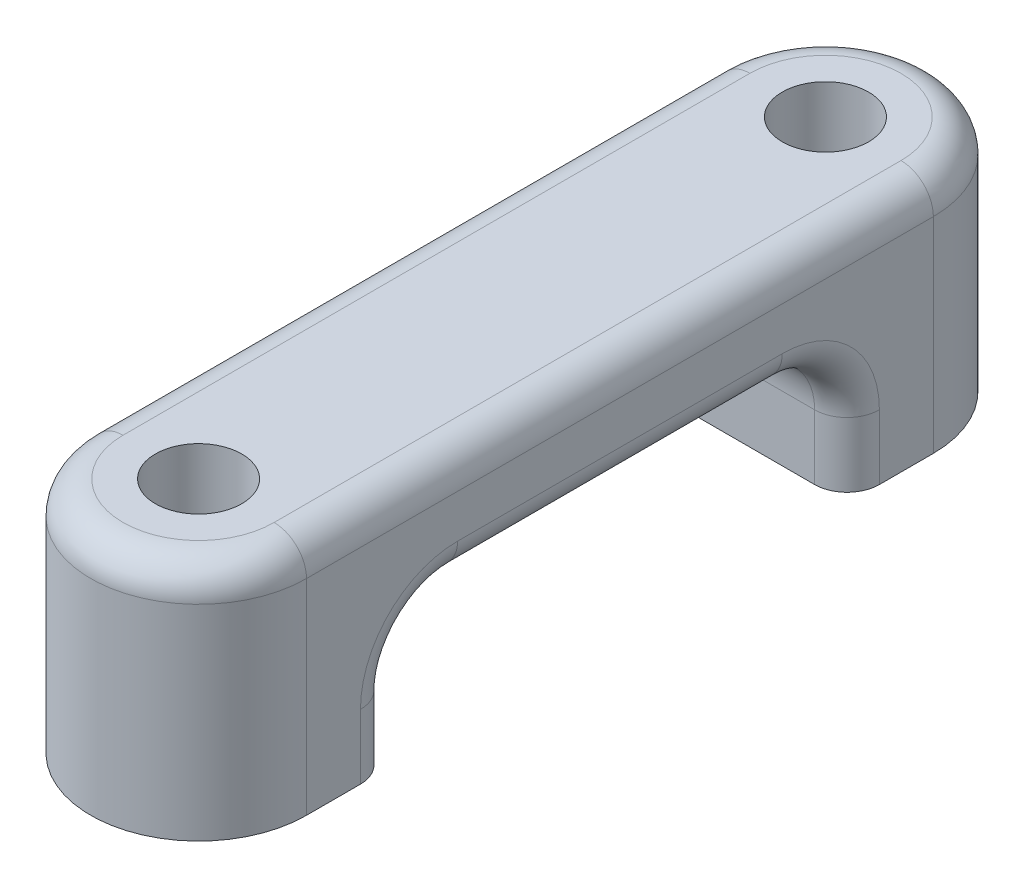
ISO-10303-21;
HEADER;
FILE_DESCRIPTION(('STEP AP214'),'2;1');
FILE_NAME('part.step','',(''),(''),'','','');
FILE_SCHEMA(('AUTOMOTIVE_DESIGN { 1 0 10303 214 1 1 1 1 }'));
ENDSEC;
DATA;
#1=APPLICATION_CONTEXT('core data for automotive mechanical design processes');
#2=APPLICATION_PROTOCOL_DEFINITION('international standard','automotive_design',2000,#1);
#3=PRODUCT_CONTEXT('',#1,'mechanical');
#4=PRODUCT('Part','Part','',(#3));
#5=PRODUCT_RELATED_PRODUCT_CATEGORY('part','',(#4));
#6=PRODUCT_DEFINITION_FORMATION('','',#4);
#7=PRODUCT_DEFINITION_CONTEXT('part definition',#1,'design');
#8=PRODUCT_DEFINITION('design','',#6,#7);
#9=PRODUCT_DEFINITION_SHAPE('','',#8);
#10=(LENGTH_UNIT() NAMED_UNIT(*) SI_UNIT(.MILLI.,.METRE.));
#11=(NAMED_UNIT(*) PLANE_ANGLE_UNIT() SI_UNIT($,.RADIAN.));
#12=(NAMED_UNIT(*) SI_UNIT($,.STERADIAN.) SOLID_ANGLE_UNIT());
#13=UNCERTAINTY_MEASURE_WITH_UNIT(LENGTH_MEASURE(1.E-05),#10,'distance_accuracy_value','');
#14=(GEOMETRIC_REPRESENTATION_CONTEXT(3) GLOBAL_UNCERTAINTY_ASSIGNED_CONTEXT((#13)) GLOBAL_UNIT_ASSIGNED_CONTEXT((#10,
#11,#12)) REPRESENTATION_CONTEXT('',''));
#15=CARTESIAN_POINT('',(0.,0.,0.));
#16=DIRECTION('',(0.,0.,1.));
#17=DIRECTION('',(1.,0.,0.));
#18=AXIS2_PLACEMENT_3D('',#15,#16,#17);
#19=CARTESIAN_POINT('',(0.,0.,-14.5206785));
#20=DIRECTION('',(0.,-1.,0.));
#21=DIRECTION('',(0.,0.,-1.));
#22=AXIS2_PLACEMENT_3D('',#19,#20,#21);
#23=PLANE('',#22);
#24=DIRECTION('',(-1.,0.,0.));
#25=VECTOR('',#24,1.);
#26=CARTESIAN_POINT('',(0.,0.,-7.5206785));
#27=LINE('',#26,#25);
#28=CARTESIAN_POINT('',(-3.5,0.,-7.5206785));
#29=VERTEX_POINT('',#28);
#30=CARTESIAN_POINT('',(3.5,0.,-7.5206785));
#31=VERTEX_POINT('',#30);
#32=EDGE_CURVE('E259',#29,#31,#27,.F.);
#33=ORIENTED_EDGE('',*,*,#32,.T.);
#34=DIRECTION('',(0.,0.,-1.));
#35=VECTOR('',#34,1.);
#36=CARTESIAN_POINT('',(3.5,0.,7.5206785));
#37=LINE('',#36,#35);
#38=CARTESIAN_POINT('',(3.5,0.,7.5206785));
#39=VERTEX_POINT('',#38);
#40=EDGE_CURVE('E11',#31,#39,#37,.F.);
#41=ORIENTED_EDGE('',*,*,#40,.T.);
#42=DIRECTION('',(1.,0.,0.));
#43=VECTOR('',#42,1.);
#44=CARTESIAN_POINT('',(0.,0.,7.5206785));
#45=LINE('',#44,#43);
#46=CARTESIAN_POINT('',(-3.5,0.,7.5206785));
#47=VERTEX_POINT('',#46);
#48=EDGE_CURVE('E255',#39,#47,#45,.F.);
#49=ORIENTED_EDGE('',*,*,#48,.T.);
#50=DIRECTION('',(0.,0.,1.));
#51=VECTOR('',#50,1.);
#52=CARTESIAN_POINT('',(-3.5,0.,-7.5206785));
#53=LINE('',#52,#51);
#54=EDGE_CURVE('E55',#47,#29,#53,.F.);
#55=ORIENTED_EDGE('',*,*,#54,.T.);
#56=EDGE_LOOP('',(#33,#41,#49,#55));
#57=FACE_BOUND('',#56,.T.);
#58=ADVANCED_FACE('F45',(#57),#23,.T.);
#59=CARTESIAN_POINT('',(0.,5.,-14.5206785));
#60=DIRECTION('',(0.,-1.,0.));
#61=DIRECTION('',(0.,0.,-1.));
#62=AXIS2_PLACEMENT_3D('',#59,#60,#61);
#63=PLANE('',#62);
#64=CARTESIAN_POINT('',(0.,5.,-14.5206785));
#65=DIRECTION('',(0.,-1.,0.));
#66=DIRECTION('',(0.,0.,-1.));
#67=AXIS2_PLACEMENT_3D('',#64,#65,#66);
#68=CIRCLE('',#67,3.5);
#69=CARTESIAN_POINT('',(3.5,5.,-14.5206785));
#70=VERTEX_POINT('',#69);
#71=CARTESIAN_POINT('',(-3.5,5.,-14.5206785));
#72=VERTEX_POINT('',#71);
#73=EDGE_CURVE('E68',#70,#72,#68,.F.);
#74=ORIENTED_EDGE('',*,*,#73,.T.);
#75=DIRECTION('',(0.,0.,1.));
#76=VECTOR('',#75,1.);
#77=CARTESIAN_POINT('',(-3.5,5.,-14.5206785));
#78=LINE('',#77,#76);
#79=CARTESIAN_POINT('',(-3.5,5.,14.5206785));
#80=VERTEX_POINT('',#79);
#81=EDGE_CURVE('E63',#72,#80,#78,.T.);
#82=ORIENTED_EDGE('',*,*,#81,.T.);
#83=CARTESIAN_POINT('',(0.,5.,14.5206785));
#84=DIRECTION('',(0.,-1.,0.));
#85=DIRECTION('',(0.,0.,-1.));
#86=AXIS2_PLACEMENT_3D('',#83,#84,#85);
#87=CIRCLE('',#86,3.5);
#88=CARTESIAN_POINT('',(3.5,5.,14.5206785));
#89=VERTEX_POINT('',#88);
#90=EDGE_CURVE('E343',#80,#89,#87,.F.);
#91=ORIENTED_EDGE('',*,*,#90,.T.);
#92=DIRECTION('',(0.,0.,-1.));
#93=VECTOR('',#92,1.);
#94=CARTESIAN_POINT('',(3.5,5.,-14.5206785));
#95=LINE('',#94,#93);
#96=EDGE_CURVE('E338',#89,#70,#95,.T.);
#97=ORIENTED_EDGE('',*,*,#96,.T.);
#98=EDGE_LOOP('',(#74,#82,#91,#97));
#99=FACE_BOUND('',#98,.T.);
#100=CARTESIAN_POINT('',(0.,5.,-14.5206785));
#101=DIRECTION('',(0.,1.,0.));
#102=DIRECTION('',(0.,0.,1.));
#103=AXIS2_PLACEMENT_3D('',#100,#101,#102);
#104=CIRCLE('',#103,2.);
#105=CARTESIAN_POINT('',(0.,5.,-12.5206785));
#106=VERTEX_POINT('',#105);
#107=EDGE_CURVE('E240',#106,#106,#104,.T.);
#108=ORIENTED_EDGE('',*,*,#107,.F.);
#109=EDGE_LOOP('',(#108));
#110=FACE_BOUND('',#109,.T.);
#111=CARTESIAN_POINT('',(0.,5.,14.5206785));
#112=DIRECTION('',(0.,1.,0.));
#113=DIRECTION('',(0.,0.,-1.));
#114=AXIS2_PLACEMENT_3D('',#111,#112,#113);
#115=CIRCLE('',#114,2.);
#116=CARTESIAN_POINT('',(0.,5.,12.5206785));
#117=VERTEX_POINT('',#116);
#118=EDGE_CURVE('E236',#117,#117,#115,.T.);
#119=ORIENTED_EDGE('',*,*,#118,.F.);
#120=EDGE_LOOP('',(#119));
#121=FACE_BOUND('',#120,.T.);
#122=ADVANCED_FACE('F480',(#99,#110,#121),#63,.F.);
#123=CARTESIAN_POINT('',(0.,5.,-14.5206785));
#124=DIRECTION('',(0.,-1.,0.));
#125=DIRECTION('',(0.,0.,-1.));
#126=AXIS2_PLACEMENT_3D('',#123,#124,#125);
#127=CYLINDRICAL_SURFACE('',#126,5.);
#128=DIRECTION('',(0.,-1.,0.));
#129=VECTOR('',#128,1.);
#130=CARTESIAN_POINT('',(-5.,5.,-14.5206785));
#131=LINE('',#130,#129);
#132=CARTESIAN_POINT('',(-5.,3.5,-14.5206785));
#133=VERTEX_POINT('',#132);
#134=CARTESIAN_POINT('',(-5.,-6.,-14.5206785));
#135=VERTEX_POINT('',#134);
#136=EDGE_CURVE('E248',#133,#135,#131,.T.);
#137=ORIENTED_EDGE('',*,*,#136,.F.);
#138=CARTESIAN_POINT('',(0.,3.5,-14.5206785));
#139=DIRECTION('',(0.,-1.,0.));
#140=DIRECTION('',(0.,0.,-1.));
#141=AXIS2_PLACEMENT_3D('',#138,#139,#140);
#142=CIRCLE('',#141,5.);
#143=CARTESIAN_POINT('',(5.,3.5,-14.5206785));
#144=VERTEX_POINT('',#143);
#145=EDGE_CURVE('E351',#133,#144,#142,.T.);
#146=ORIENTED_EDGE('',*,*,#145,.T.);
#147=DIRECTION('',(0.,-1.,0.));
#148=VECTOR('',#147,1.);
#149=CARTESIAN_POINT('',(5.,5.,-14.5206785));
#150=LINE('',#149,#148);
#151=CARTESIAN_POINT('',(5.,-6.,-14.5206785));
#152=VERTEX_POINT('',#151);
#153=EDGE_CURVE('E200',#144,#152,#150,.T.);
#154=ORIENTED_EDGE('',*,*,#153,.T.);
#155=CARTESIAN_POINT('',(0.,-6.,-14.5206785));
#156=DIRECTION('',(0.,-1.,0.));
#157=DIRECTION('',(0.,0.,-1.));
#158=AXIS2_PLACEMENT_3D('',#155,#156,#157);
#159=CIRCLE('',#158,5.);
#160=EDGE_CURVE('E224',#135,#152,#159,.T.);
#161=ORIENTED_EDGE('',*,*,#160,.F.);
#162=EDGE_LOOP('',(#137,#146,#154,#161));
#163=FACE_BOUND('',#162,.T.);
#164=ADVANCED_FACE('F405',(#163),#127,.T.);
#165=CARTESIAN_POINT('',(-5.,5.,14.5206785));
#166=DIRECTION('',(1.,0.,0.));
#167=DIRECTION('',(0.,0.,-1.));
#168=AXIS2_PLACEMENT_3D('',#165,#166,#167);
#169=PLANE('',#168);
#170=DIRECTION('',(0.,0.,-1.));
#171=VECTOR('',#170,1.);
#172=CARTESIAN_POINT('',(-5.,-6.,-10.5206785));
#173=LINE('',#172,#171);
#174=CARTESIAN_POINT('',(-5.,-6.,-12.0206785));
#175=VERTEX_POINT('',#174);
#176=EDGE_CURVE('E220',#175,#135,#173,.T.);
#177=ORIENTED_EDGE('',*,*,#176,.F.);
#178=DIRECTION('',(0.,1.,0.));
#179=VECTOR('',#178,1.);
#180=CARTESIAN_POINT('',(-5.,5.,-12.0206785));
#181=LINE('',#180,#179);
#182=CARTESIAN_POINT('',(-5.,-3.,-12.0206785));
#183=VERTEX_POINT('',#182);
#184=EDGE_CURVE('E334',#175,#183,#181,.T.);
#185=ORIENTED_EDGE('',*,*,#184,.T.);
#186=CARTESIAN_POINT('',(-5.,-3.,-7.5206785));
#187=DIRECTION('',(1.,0.,0.));
#188=DIRECTION('',(0.,0.,-1.));
#189=AXIS2_PLACEMENT_3D('',#186,#187,#188);
#190=CIRCLE('',#189,4.5);
#191=CARTESIAN_POINT('',(-5.,1.5,-7.5206785));
#192=VERTEX_POINT('',#191);
#193=EDGE_CURVE('E331',#183,#192,#190,.T.);
#194=ORIENTED_EDGE('',*,*,#193,.T.);
#195=DIRECTION('',(0.,0.,1.));
#196=VECTOR('',#195,1.);
#197=CARTESIAN_POINT('',(-5.,1.5,7.5206785));
#198=LINE('',#197,#196);
#199=CARTESIAN_POINT('',(-5.,1.5,7.5206785));
#200=VERTEX_POINT('',#199);
#201=EDGE_CURVE('E322',#192,#200,#198,.T.);
#202=ORIENTED_EDGE('',*,*,#201,.T.);
#203=CARTESIAN_POINT('',(-5.,-3.,7.5206785));
#204=DIRECTION('',(1.,0.,0.));
#205=DIRECTION('',(0.,0.,-1.));
#206=AXIS2_PLACEMENT_3D('',#203,#204,#205);
#207=CIRCLE('',#206,4.5);
#208=CARTESIAN_POINT('',(-5.,-3.,12.0206785));
#209=VERTEX_POINT('',#208);
#210=EDGE_CURVE('E325',#200,#209,#207,.T.);
#211=ORIENTED_EDGE('',*,*,#210,.T.);
#212=DIRECTION('',(0.,1.,0.));
#213=VECTOR('',#212,1.);
#214=CARTESIAN_POINT('',(-5.,5.,12.0206785));
#215=LINE('',#214,#213);
#216=CARTESIAN_POINT('',(-5.,-6.,12.0206785));
#217=VERTEX_POINT('',#216);
#218=EDGE_CURVE('E328',#209,#217,#215,.F.);
#219=ORIENTED_EDGE('',*,*,#218,.T.);
#220=DIRECTION('',(0.,0.,-1.));
#221=VECTOR('',#220,1.);
#222=CARTESIAN_POINT('',(-5.,-6.,14.5206785));
#223=LINE('',#222,#221);
#224=CARTESIAN_POINT('',(-5.,-6.,14.5206785));
#225=VERTEX_POINT('',#224);
#226=EDGE_CURVE('E207',#225,#217,#223,.T.);
#227=ORIENTED_EDGE('',*,*,#226,.F.);
#228=DIRECTION('',(0.,-1.,0.));
#229=VECTOR('',#228,1.);
#230=CARTESIAN_POINT('',(-5.,5.,14.5206785));
#231=LINE('',#230,#229);
#232=CARTESIAN_POINT('',(-5.,3.5,14.5206785));
#233=VERTEX_POINT('',#232);
#234=EDGE_CURVE('E199',#233,#225,#231,.T.);
#235=ORIENTED_EDGE('',*,*,#234,.F.);
#236=DIRECTION('',(0.,0.,1.));
#237=VECTOR('',#236,1.);
#238=CARTESIAN_POINT('',(-5.,3.5,14.5206785));
#239=LINE('',#238,#237);
#240=EDGE_CURVE('E319',#233,#133,#239,.F.);
#241=ORIENTED_EDGE('',*,*,#240,.T.);
#242=ORIENTED_EDGE('',*,*,#136,.T.);
#243=EDGE_LOOP('',(#177,#185,#194,#202,#211,#219,#227,#235,#241,#242));
#244=FACE_BOUND('',#243,.T.);
#245=ADVANCED_FACE('F438',(#244),#169,.F.);
#246=CARTESIAN_POINT('',(0.,5.,14.5206785));
#247=DIRECTION('',(0.,-1.,0.));
#248=DIRECTION('',(0.,0.,-1.));
#249=AXIS2_PLACEMENT_3D('',#246,#247,#248);
#250=CYLINDRICAL_SURFACE('',#249,5.);
#251=DIRECTION('',(0.,-1.,0.));
#252=VECTOR('',#251,1.);
#253=CARTESIAN_POINT('',(5.,5.,14.5206785));
#254=LINE('',#253,#252);
#255=CARTESIAN_POINT('',(5.,3.5,14.5206785));
#256=VERTEX_POINT('',#255);
#257=CARTESIAN_POINT('',(5.,-6.,14.5206785));
#258=VERTEX_POINT('',#257);
#259=EDGE_CURVE('E190',#256,#258,#254,.T.);
#260=ORIENTED_EDGE('',*,*,#259,.F.);
#261=CARTESIAN_POINT('',(0.,3.5,14.5206785));
#262=DIRECTION('',(0.,-1.,0.));
#263=DIRECTION('',(0.,0.,-1.));
#264=AXIS2_PLACEMENT_3D('',#261,#262,#263);
#265=CIRCLE('',#264,5.);
#266=EDGE_CURVE('E348',#256,#233,#265,.T.);
#267=ORIENTED_EDGE('',*,*,#266,.T.);
#268=ORIENTED_EDGE('',*,*,#234,.T.);
#269=CARTESIAN_POINT('',(0.,-6.,14.5206785));
#270=DIRECTION('',(0.,-1.,0.));
#271=DIRECTION('',(0.,0.,-1.));
#272=AXIS2_PLACEMENT_3D('',#269,#270,#271);
#273=CIRCLE('',#272,5.);
#274=EDGE_CURVE('E179',#258,#225,#273,.T.);
#275=ORIENTED_EDGE('',*,*,#274,.F.);
#276=EDGE_LOOP('',(#260,#267,#268,#275));
#277=FACE_BOUND('',#276,.T.);
#278=ADVANCED_FACE('F202',(#277),#250,.T.);
#279=CARTESIAN_POINT('',(5.,5.,14.5206785));
#280=DIRECTION('',(-1.,0.,0.));
#281=DIRECTION('',(0.,0.,1.));
#282=AXIS2_PLACEMENT_3D('',#279,#280,#281);
#283=PLANE('',#282);
#284=DIRECTION('',(0.,0.,1.));
#285=VECTOR('',#284,1.);
#286=CARTESIAN_POINT('',(5.,-6.,10.5206785));
#287=LINE('',#286,#285);
#288=CARTESIAN_POINT('',(5.,-6.,12.0206785));
#289=VERTEX_POINT('',#288);
#290=EDGE_CURVE('E172',#289,#258,#287,.T.);
#291=ORIENTED_EDGE('',*,*,#290,.F.);
#292=DIRECTION('',(0.,1.,0.));
#293=VECTOR('',#292,1.);
#294=CARTESIAN_POINT('',(5.,5.,12.0206785));
#295=LINE('',#294,#293);
#296=CARTESIAN_POINT('',(5.,-3.,12.0206785));
#297=VERTEX_POINT('',#296);
#298=EDGE_CURVE('E281',#289,#297,#295,.T.);
#299=ORIENTED_EDGE('',*,*,#298,.T.);
#300=CARTESIAN_POINT('',(5.,-3.,7.5206785));
#301=DIRECTION('',(-1.,0.,0.));
#302=DIRECTION('',(0.,0.,1.));
#303=AXIS2_PLACEMENT_3D('',#300,#301,#302);
#304=CIRCLE('',#303,4.5);
#305=CARTESIAN_POINT('',(5.,1.5,7.5206785));
#306=VERTEX_POINT('',#305);
#307=EDGE_CURVE('E278',#297,#306,#304,.T.);
#308=ORIENTED_EDGE('',*,*,#307,.T.);
#309=DIRECTION('',(0.,0.,-1.));
#310=VECTOR('',#309,1.);
#311=CARTESIAN_POINT('',(5.,1.5,-7.5206785));
#312=LINE('',#311,#310);
#313=CARTESIAN_POINT('',(5.,1.5,-7.5206785));
#314=VERTEX_POINT('',#313);
#315=EDGE_CURVE('E269',#306,#314,#312,.T.);
#316=ORIENTED_EDGE('',*,*,#315,.T.);
#317=CARTESIAN_POINT('',(5.,-3.,-7.5206785));
#318=DIRECTION('',(-1.,0.,0.));
#319=DIRECTION('',(0.,0.,1.));
#320=AXIS2_PLACEMENT_3D('',#317,#318,#319);
#321=CIRCLE('',#320,4.5);
#322=CARTESIAN_POINT('',(5.,-3.,-12.0206785));
#323=VERTEX_POINT('',#322);
#324=EDGE_CURVE('E272',#314,#323,#321,.T.);
#325=ORIENTED_EDGE('',*,*,#324,.T.);
#326=DIRECTION('',(0.,1.,0.));
#327=VECTOR('',#326,1.);
#328=CARTESIAN_POINT('',(5.,5.,-12.0206785));
#329=LINE('',#328,#327);
#330=CARTESIAN_POINT('',(5.,-6.,-12.0206785));
#331=VERTEX_POINT('',#330);
#332=EDGE_CURVE('E275',#323,#331,#329,.F.);
#333=ORIENTED_EDGE('',*,*,#332,.T.);
#334=DIRECTION('',(0.,0.,1.));
#335=VECTOR('',#334,1.);
#336=CARTESIAN_POINT('',(5.,-6.,-14.5206785));
#337=LINE('',#336,#335);
#338=EDGE_CURVE('E228',#152,#331,#337,.T.);
#339=ORIENTED_EDGE('',*,*,#338,.F.);
#340=ORIENTED_EDGE('',*,*,#153,.F.);
#341=DIRECTION('',(0.,0.,-1.));
#342=VECTOR('',#341,1.);
#343=CARTESIAN_POINT('',(5.,3.5,14.5206785));
#344=LINE('',#343,#342);
#345=EDGE_CURVE('E194',#144,#256,#344,.F.);
#346=ORIENTED_EDGE('',*,*,#345,.T.);
#347=ORIENTED_EDGE('',*,*,#259,.T.);
#348=EDGE_LOOP('',(#291,#299,#308,#316,#325,#333,#339,#340,#346,#347));
#349=FACE_BOUND('',#348,.T.);
#350=ADVANCED_FACE('F191',(#349),#283,.F.);
#351=CARTESIAN_POINT('',(0.,5.,-14.5206785));
#352=DIRECTION('',(0.,-1.,0.));
#353=DIRECTION('',(0.,0.,-1.));
#354=AXIS2_PLACEMENT_3D('',#351,#352,#353);
#355=CYLINDRICAL_SURFACE('',#354,2.);
#356=ORIENTED_EDGE('',*,*,#107,.T.);
#357=EDGE_LOOP('',(#356));
#358=FACE_BOUND('',#357,.T.);
#359=CARTESIAN_POINT('',(0.,-6.,-14.5206785));
#360=DIRECTION('',(0.,-1.,0.));
#361=DIRECTION('',(0.,0.,-1.));
#362=AXIS2_PLACEMENT_3D('',#359,#360,#361);
#363=CIRCLE('',#362,2.);
#364=CARTESIAN_POINT('',(0.,-6.,-16.5206785));
#365=VERTEX_POINT('',#364);
#366=EDGE_CURVE('E212',#365,#365,#363,.T.);
#367=ORIENTED_EDGE('',*,*,#366,.T.);
#368=EDGE_LOOP('',(#367));
#369=FACE_BOUND('',#368,.T.);
#370=ADVANCED_FACE('F491',(#358,#369),#355,.F.);
#371=CARTESIAN_POINT('',(0.,5.,14.5206785));
#372=DIRECTION('',(0.,-1.,0.));
#373=DIRECTION('',(0.,0.,-1.));
#374=AXIS2_PLACEMENT_3D('',#371,#372,#373);
#375=CYLINDRICAL_SURFACE('',#374,2.);
#376=ORIENTED_EDGE('',*,*,#118,.T.);
#377=EDGE_LOOP('',(#376));
#378=FACE_BOUND('',#377,.T.);
#379=CARTESIAN_POINT('',(0.,-6.,14.5206785));
#380=DIRECTION('',(0.,-1.,0.));
#381=DIRECTION('',(0.,0.,-1.));
#382=AXIS2_PLACEMENT_3D('',#379,#380,#381);
#383=CIRCLE('',#382,2.);
#384=CARTESIAN_POINT('',(0.,-6.,12.5206785));
#385=VERTEX_POINT('',#384);
#386=EDGE_CURVE('E206',#385,#385,#383,.T.);
#387=ORIENTED_EDGE('',*,*,#386,.T.);
#388=EDGE_LOOP('',(#387));
#389=FACE_BOUND('',#388,.T.);
#390=ADVANCED_FACE('F689',(#378,#389),#375,.F.);
#391=CARTESIAN_POINT('',(0.,-6.,-14.5206785));
#392=DIRECTION('',(0.,-1.,0.));
#393=DIRECTION('',(0.,0.,-1.));
#394=AXIS2_PLACEMENT_3D('',#391,#392,#393);
#395=PLANE('',#394);
#396=ORIENTED_EDGE('',*,*,#338,.T.);
#397=CARTESIAN_POINT('',(3.5,-6.,-12.0206785));
#398=DIRECTION('',(0.,-1.,0.));
#399=DIRECTION('',(0.,0.,-1.));
#400=AXIS2_PLACEMENT_3D('',#397,#398,#399);
#401=CIRCLE('',#400,1.5);
#402=CARTESIAN_POINT('',(3.5,-6.,-10.5206785));
#403=VERTEX_POINT('',#402);
#404=EDGE_CURVE('E310',#331,#403,#401,.T.);
#405=ORIENTED_EDGE('',*,*,#404,.T.);
#406=DIRECTION('',(-1.,0.,0.));
#407=VECTOR('',#406,1.);
#408=CARTESIAN_POINT('',(-5.,-6.,-10.5206785));
#409=LINE('',#408,#407);
#410=CARTESIAN_POINT('',(-3.5,-6.,-10.5206785));
#411=VERTEX_POINT('',#410);
#412=EDGE_CURVE('E232',#403,#411,#409,.T.);
#413=ORIENTED_EDGE('',*,*,#412,.T.);
#414=CARTESIAN_POINT('',(-3.5,-6.,-12.0206785));
#415=DIRECTION('',(0.,-1.,0.));
#416=DIRECTION('',(0.,0.,-1.));
#417=AXIS2_PLACEMENT_3D('',#414,#415,#416);
#418=CIRCLE('',#417,1.5);
#419=EDGE_CURVE('E307',#411,#175,#418,.T.);
#420=ORIENTED_EDGE('',*,*,#419,.T.);
#421=ORIENTED_EDGE('',*,*,#176,.T.);
#422=ORIENTED_EDGE('',*,*,#160,.T.);
#423=EDGE_LOOP('',(#396,#405,#413,#420,#421,#422));
#424=FACE_BOUND('',#423,.T.);
#425=ORIENTED_EDGE('',*,*,#366,.F.);
#426=EDGE_LOOP('',(#425));
#427=FACE_BOUND('',#426,.T.);
#428=ADVANCED_FACE('F411',(#424,#427),#395,.T.);
#429=CARTESIAN_POINT('',(-5.,-6.,-10.5206785));
#430=DIRECTION('',(0.,0.,-1.));
#431=DIRECTION('',(-1.,0.,0.));
#432=AXIS2_PLACEMENT_3D('',#429,#430,#431);
#433=PLANE('',#432);
#434=ORIENTED_EDGE('',*,*,#412,.F.);
#435=DIRECTION('',(0.,1.,0.));
#436=VECTOR('',#435,1.);
#437=CARTESIAN_POINT('',(3.5,-6.,-10.5206785));
#438=LINE('',#437,#436);
#439=CARTESIAN_POINT('',(3.5,-3.,-10.5206785));
#440=VERTEX_POINT('',#439);
#441=EDGE_CURVE('E304',#403,#440,#438,.T.);
#442=ORIENTED_EDGE('',*,*,#441,.T.);
#443=DIRECTION('',(-1.,0.,0.));
#444=VECTOR('',#443,1.);
#445=CARTESIAN_POINT('',(-5.,-3.,-10.5206785));
#446=LINE('',#445,#444);
#447=CARTESIAN_POINT('',(-3.5,-3.,-10.5206785));
#448=VERTEX_POINT('',#447);
#449=EDGE_CURVE('E251',#440,#448,#446,.T.);
#450=ORIENTED_EDGE('',*,*,#449,.T.);
#451=DIRECTION('',(0.,1.,0.));
#452=VECTOR('',#451,1.);
#453=CARTESIAN_POINT('',(-3.5,-6.,-10.5206785));
#454=LINE('',#453,#452);
#455=EDGE_CURVE('E301',#448,#411,#454,.F.);
#456=ORIENTED_EDGE('',*,*,#455,.T.);
#457=EDGE_LOOP('',(#434,#442,#450,#456));
#458=FACE_BOUND('',#457,.T.);
#459=ADVANCED_FACE('F421',(#458),#433,.F.);
#460=CARTESIAN_POINT('',(0.,-6.,14.5206785));
#461=DIRECTION('',(0.,-1.,0.));
#462=DIRECTION('',(0.,0.,-1.));
#463=AXIS2_PLACEMENT_3D('',#460,#461,#462);
#464=PLANE('',#463);
#465=DIRECTION('',(1.,0.,0.));
#466=VECTOR('',#465,1.);
#467=CARTESIAN_POINT('',(-5.,-6.,10.5206785));
#468=LINE('',#467,#466);
#469=CARTESIAN_POINT('',(-3.5,-6.,10.5206785));
#470=VERTEX_POINT('',#469);
#471=CARTESIAN_POINT('',(3.5,-6.,10.5206785));
#472=VERTEX_POINT('',#471);
#473=EDGE_CURVE('E186',#470,#472,#468,.T.);
#474=ORIENTED_EDGE('',*,*,#473,.T.);
#475=CARTESIAN_POINT('',(3.5,-6.,12.0206785));
#476=DIRECTION('',(0.,-1.,0.));
#477=DIRECTION('',(0.,0.,-1.));
#478=AXIS2_PLACEMENT_3D('',#475,#476,#477);
#479=CIRCLE('',#478,1.5);
#480=EDGE_CURVE('E181',#472,#289,#479,.T.);
#481=ORIENTED_EDGE('',*,*,#480,.T.);
#482=ORIENTED_EDGE('',*,*,#290,.T.);
#483=ORIENTED_EDGE('',*,*,#274,.T.);
#484=ORIENTED_EDGE('',*,*,#226,.T.);
#485=CARTESIAN_POINT('',(-3.5,-6.,12.0206785));
#486=DIRECTION('',(0.,-1.,0.));
#487=DIRECTION('',(0.,0.,-1.));
#488=AXIS2_PLACEMENT_3D('',#485,#486,#487);
#489=CIRCLE('',#488,1.5);
#490=EDGE_CURVE('E290',#217,#470,#489,.T.);
#491=ORIENTED_EDGE('',*,*,#490,.T.);
#492=EDGE_LOOP('',(#474,#481,#482,#483,#484,#491));
#493=FACE_BOUND('',#492,.T.);
#494=ORIENTED_EDGE('',*,*,#386,.F.);
#495=EDGE_LOOP('',(#494));
#496=FACE_BOUND('',#495,.T.);
#497=ADVANCED_FACE('F175',(#493,#496),#464,.T.);
#498=CARTESIAN_POINT('',(-5.,-6.,10.5206785));
#499=DIRECTION('',(0.,0.,1.));
#500=DIRECTION('',(1.,0.,0.));
#501=AXIS2_PLACEMENT_3D('',#498,#499,#500);
#502=PLANE('',#501);
#503=DIRECTION('',(1.,0.,0.));
#504=VECTOR('',#503,1.);
#505=CARTESIAN_POINT('',(-5.,-3.,10.5206785));
#506=LINE('',#505,#504);
#507=CARTESIAN_POINT('',(-3.5,-3.,10.5206785));
#508=VERTEX_POINT('',#507);
#509=CARTESIAN_POINT('',(3.5,-3.,10.5206785));
#510=VERTEX_POINT('',#509);
#511=EDGE_CURVE('E263',#508,#510,#506,.T.);
#512=ORIENTED_EDGE('',*,*,#511,.T.);
#513=DIRECTION('',(0.,1.,0.));
#514=VECTOR('',#513,1.);
#515=CARTESIAN_POINT('',(3.5,-6.,10.5206785));
#516=LINE('',#515,#514);
#517=EDGE_CURVE('E287',#510,#472,#516,.F.);
#518=ORIENTED_EDGE('',*,*,#517,.T.);
#519=ORIENTED_EDGE('',*,*,#473,.F.);
#520=DIRECTION('',(0.,1.,0.));
#521=VECTOR('',#520,1.);
#522=CARTESIAN_POINT('',(-3.5,-6.,10.5206785));
#523=LINE('',#522,#521);
#524=EDGE_CURVE('E284',#470,#508,#523,.T.);
#525=ORIENTED_EDGE('',*,*,#524,.T.);
#526=EDGE_LOOP('',(#512,#518,#519,#525));
#527=FACE_BOUND('',#526,.T.);
#528=ADVANCED_FACE('F449',(#527),#502,.F.);
#529=CARTESIAN_POINT('',(-5.,-3.,-7.5206785));
#530=DIRECTION('',(-1.,0.,0.));
#531=DIRECTION('',(0.,0.,1.));
#532=AXIS2_PLACEMENT_3D('',#529,#530,#531);
#533=CYLINDRICAL_SURFACE('',#532,3.);
#534=ORIENTED_EDGE('',*,*,#449,.F.);
#535=CARTESIAN_POINT('',(3.5,-3.,-7.5206785));
#536=DIRECTION('',(-1.,0.,0.));
#537=DIRECTION('',(0.,0.,1.));
#538=AXIS2_PLACEMENT_3D('',#535,#536,#537);
#539=CIRCLE('',#538,3.);
#540=EDGE_CURVE('E316',#440,#31,#539,.F.);
#541=ORIENTED_EDGE('',*,*,#540,.T.);
#542=ORIENTED_EDGE('',*,*,#32,.F.);
#543=CARTESIAN_POINT('',(-3.5,-3.,-7.5206785));
#544=DIRECTION('',(1.,0.,0.));
#545=DIRECTION('',(0.,0.,-1.));
#546=AXIS2_PLACEMENT_3D('',#543,#544,#545);
#547=CIRCLE('',#546,3.);
#548=EDGE_CURVE('E313',#29,#448,#547,.F.);
#549=ORIENTED_EDGE('',*,*,#548,.T.);
#550=EDGE_LOOP('',(#534,#541,#542,#549));
#551=FACE_BOUND('',#550,.T.);
#552=ADVANCED_FACE('F424',(#551),#533,.F.);
#553=CARTESIAN_POINT('',(-5.,-3.,7.5206785));
#554=DIRECTION('',(1.,0.,0.));
#555=DIRECTION('',(0.,0.,-1.));
#556=AXIS2_PLACEMENT_3D('',#553,#554,#555);
#557=CYLINDRICAL_SURFACE('',#556,3.);
#558=ORIENTED_EDGE('',*,*,#48,.F.);
#559=CARTESIAN_POINT('',(3.5,-3.,7.5206785));
#560=DIRECTION('',(-1.,0.,0.));
#561=DIRECTION('',(0.,0.,1.));
#562=AXIS2_PLACEMENT_3D('',#559,#560,#561);
#563=CIRCLE('',#562,3.);
#564=EDGE_CURVE('E298',#39,#510,#563,.F.);
#565=ORIENTED_EDGE('',*,*,#564,.T.);
#566=ORIENTED_EDGE('',*,*,#511,.F.);
#567=CARTESIAN_POINT('',(-3.5,-3.,7.5206785));
#568=DIRECTION('',(1.,0.,0.));
#569=DIRECTION('',(0.,0.,-1.));
#570=AXIS2_PLACEMENT_3D('',#567,#568,#569);
#571=CIRCLE('',#570,3.);
#572=EDGE_CURVE('E295',#508,#47,#571,.F.);
#573=ORIENTED_EDGE('',*,*,#572,.T.);
#574=EDGE_LOOP('',(#558,#565,#566,#573));
#575=FACE_BOUND('',#574,.T.);
#576=ADVANCED_FACE('F453',(#575),#557,.F.);
#577=CARTESIAN_POINT('',(3.5,-6.,-12.0206785));
#578=DIRECTION('',(0.,1.,0.));
#579=DIRECTION('',(0.,0.,1.));
#580=AXIS2_PLACEMENT_3D('',#577,#578,#579);
#581=CYLINDRICAL_SURFACE('',#580,1.5);
#582=ORIENTED_EDGE('',*,*,#404,.F.);
#583=ORIENTED_EDGE('',*,*,#332,.F.);
#584=CARTESIAN_POINT('',(3.5,-3.,-12.0206785));
#585=DIRECTION('',(0.,1.,0.));
#586=DIRECTION('',(0.,0.,1.));
#587=AXIS2_PLACEMENT_3D('',#584,#585,#586);
#588=CIRCLE('',#587,1.5);
#589=EDGE_CURVE('E187',#440,#323,#588,.T.);
#590=ORIENTED_EDGE('',*,*,#589,.F.);
#591=ORIENTED_EDGE('',*,*,#441,.F.);
#592=EDGE_LOOP('',(#582,#583,#590,#591));
#593=FACE_BOUND('',#592,.T.);
#594=ADVANCED_FACE('F416',(#593),#581,.T.);
#595=CARTESIAN_POINT('',(3.5,-3.,-7.5206785));
#596=DIRECTION('',(-1.,0.,0.));
#597=DIRECTION('',(0.,0.,1.));
#598=AXIS2_PLACEMENT_3D('',#595,#596,#597);
#599=TOROIDAL_SURFACE('',#598,4.5,1.5);
#600=ORIENTED_EDGE('',*,*,#589,.T.);
#601=ORIENTED_EDGE('',*,*,#324,.F.);
#602=CARTESIAN_POINT('',(3.5,1.5,-7.5206785));
#603=DIRECTION('',(0.,0.,1.));
#604=DIRECTION('',(1.,0.,0.));
#605=AXIS2_PLACEMENT_3D('',#602,#603,#604);
#606=CIRCLE('',#605,1.5);
#607=EDGE_CURVE('E364',#31,#314,#606,.T.);
#608=ORIENTED_EDGE('',*,*,#607,.F.);
#609=ORIENTED_EDGE('',*,*,#540,.F.);
#610=EDGE_LOOP('',(#600,#601,#608,#609));
#611=FACE_BOUND('',#610,.T.);
#612=ADVANCED_FACE('F470',(#611),#599,.T.);
#613=CARTESIAN_POINT('',(3.5,1.5,14.5206785));
#614=DIRECTION('',(0.,0.,1.));
#615=DIRECTION('',(1.,0.,0.));
#616=AXIS2_PLACEMENT_3D('',#613,#614,#615);
#617=CYLINDRICAL_SURFACE('',#616,1.5);
#618=ORIENTED_EDGE('',*,*,#607,.T.);
#619=ORIENTED_EDGE('',*,*,#315,.F.);
#620=CARTESIAN_POINT('',(3.5,1.5,7.5206785));
#621=DIRECTION('',(0.,0.,1.));
#622=DIRECTION('',(1.,0.,0.));
#623=AXIS2_PLACEMENT_3D('',#620,#621,#622);
#624=CIRCLE('',#623,1.5);
#625=EDGE_CURVE('E359',#39,#306,#624,.T.);
#626=ORIENTED_EDGE('',*,*,#625,.F.);
#627=ORIENTED_EDGE('',*,*,#40,.F.);
#628=EDGE_LOOP('',(#618,#619,#626,#627));
#629=FACE_BOUND('',#628,.T.);
#630=ADVANCED_FACE('F466',(#629),#617,.T.);
#631=CARTESIAN_POINT('',(3.5,-3.,7.5206785));
#632=DIRECTION('',(-1.,0.,0.));
#633=DIRECTION('',(0.,0.,1.));
#634=AXIS2_PLACEMENT_3D('',#631,#632,#633);
#635=TOROIDAL_SURFACE('',#634,4.5,1.5);
#636=ORIENTED_EDGE('',*,*,#625,.T.);
#637=ORIENTED_EDGE('',*,*,#307,.F.);
#638=CARTESIAN_POINT('',(3.5,-3.,12.0206785));
#639=DIRECTION('',(0.,-1.,0.));
#640=DIRECTION('',(0.,0.,-1.));
#641=AXIS2_PLACEMENT_3D('',#638,#639,#640);
#642=CIRCLE('',#641,1.5);
#643=EDGE_CURVE('E356',#510,#297,#642,.T.);
#644=ORIENTED_EDGE('',*,*,#643,.F.);
#645=ORIENTED_EDGE('',*,*,#564,.F.);
#646=EDGE_LOOP('',(#636,#637,#644,#645));
#647=FACE_BOUND('',#646,.T.);
#648=ADVANCED_FACE('F458',(#647),#635,.T.);
#649=CARTESIAN_POINT('',(3.5,5.,12.0206785));
#650=DIRECTION('',(0.,1.,0.));
#651=DIRECTION('',(0.,0.,1.));
#652=AXIS2_PLACEMENT_3D('',#649,#650,#651);
#653=CYLINDRICAL_SURFACE('',#652,1.5);
#654=ORIENTED_EDGE('',*,*,#480,.F.);
#655=ORIENTED_EDGE('',*,*,#517,.F.);
#656=ORIENTED_EDGE('',*,*,#643,.T.);
#657=ORIENTED_EDGE('',*,*,#298,.F.);
#658=EDGE_LOOP('',(#654,#655,#656,#657));
#659=FACE_BOUND('',#658,.T.);
#660=ADVANCED_FACE('F461',(#659),#653,.T.);
#661=CARTESIAN_POINT('',(-3.5,-6.,12.0206785));
#662=DIRECTION('',(0.,1.,0.));
#663=DIRECTION('',(0.,0.,1.));
#664=AXIS2_PLACEMENT_3D('',#661,#662,#663);
#665=CYLINDRICAL_SURFACE('',#664,1.5);
#666=ORIENTED_EDGE('',*,*,#490,.F.);
#667=ORIENTED_EDGE('',*,*,#218,.F.);
#668=CARTESIAN_POINT('',(-3.5,-3.,12.0206785));
#669=DIRECTION('',(0.,1.,0.));
#670=DIRECTION('',(0.,0.,1.));
#671=AXIS2_PLACEMENT_3D('',#668,#669,#670);
#672=CIRCLE('',#671,1.5);
#673=EDGE_CURVE('E360',#508,#209,#672,.T.);
#674=ORIENTED_EDGE('',*,*,#673,.F.);
#675=ORIENTED_EDGE('',*,*,#524,.F.);
#676=EDGE_LOOP('',(#666,#667,#674,#675));
#677=FACE_BOUND('',#676,.T.);
#678=ADVANCED_FACE('F444',(#677),#665,.T.);
#679=CARTESIAN_POINT('',(-3.5,-3.,7.5206785));
#680=DIRECTION('',(1.,0.,0.));
#681=DIRECTION('',(0.,0.,-1.));
#682=AXIS2_PLACEMENT_3D('',#679,#680,#681);
#683=TOROIDAL_SURFACE('',#682,4.5,1.5);
#684=ORIENTED_EDGE('',*,*,#673,.T.);
#685=ORIENTED_EDGE('',*,*,#210,.F.);
#686=CARTESIAN_POINT('',(-3.5,1.5,7.5206785));
#687=DIRECTION('',(0.,0.,-1.));
#688=DIRECTION('',(-1.,0.,0.));
#689=AXIS2_PLACEMENT_3D('',#686,#687,#688);
#690=CIRCLE('',#689,1.5);
#691=EDGE_CURVE('E378',#47,#200,#690,.T.);
#692=ORIENTED_EDGE('',*,*,#691,.F.);
#693=ORIENTED_EDGE('',*,*,#572,.F.);
#694=EDGE_LOOP('',(#684,#685,#692,#693));
#695=FACE_BOUND('',#694,.T.);
#696=ADVANCED_FACE('F519',(#695),#683,.T.);
#697=CARTESIAN_POINT('',(-3.5,1.5,14.5206785));
#698=DIRECTION('',(0.,0.,-1.));
#699=DIRECTION('',(-1.,0.,0.));
#700=AXIS2_PLACEMENT_3D('',#697,#698,#699);
#701=CYLINDRICAL_SURFACE('',#700,1.5);
#702=ORIENTED_EDGE('',*,*,#691,.T.);
#703=ORIENTED_EDGE('',*,*,#201,.F.);
#704=CARTESIAN_POINT('',(-3.5,1.5,-7.5206785));
#705=DIRECTION('',(0.,0.,-1.));
#706=DIRECTION('',(-1.,0.,0.));
#707=AXIS2_PLACEMENT_3D('',#704,#705,#706);
#708=CIRCLE('',#707,1.5);
#709=EDGE_CURVE('E374',#29,#192,#708,.T.);
#710=ORIENTED_EDGE('',*,*,#709,.F.);
#711=ORIENTED_EDGE('',*,*,#54,.F.);
#712=EDGE_LOOP('',(#702,#703,#710,#711));
#713=FACE_BOUND('',#712,.T.);
#714=ADVANCED_FACE('F526',(#713),#701,.T.);
#715=CARTESIAN_POINT('',(-3.5,-3.,-7.5206785));
#716=DIRECTION('',(1.,0.,0.));
#717=DIRECTION('',(0.,0.,-1.));
#718=AXIS2_PLACEMENT_3D('',#715,#716,#717);
#719=TOROIDAL_SURFACE('',#718,4.5,1.5);
#720=ORIENTED_EDGE('',*,*,#709,.T.);
#721=ORIENTED_EDGE('',*,*,#193,.F.);
#722=CARTESIAN_POINT('',(-3.5,-3.,-12.0206785));
#723=DIRECTION('',(0.,-1.,0.));
#724=DIRECTION('',(0.,0.,-1.));
#725=AXIS2_PLACEMENT_3D('',#722,#723,#724);
#726=CIRCLE('',#725,1.5);
#727=EDGE_CURVE('E371',#448,#183,#726,.T.);
#728=ORIENTED_EDGE('',*,*,#727,.F.);
#729=ORIENTED_EDGE('',*,*,#548,.F.);
#730=EDGE_LOOP('',(#720,#721,#728,#729));
#731=FACE_BOUND('',#730,.T.);
#732=ADVANCED_FACE('F430',(#731),#719,.T.);
#733=CARTESIAN_POINT('',(-3.5,5.,-12.0206785));
#734=DIRECTION('',(0.,1.,0.));
#735=DIRECTION('',(0.,0.,1.));
#736=AXIS2_PLACEMENT_3D('',#733,#734,#735);
#737=CYLINDRICAL_SURFACE('',#736,1.5);
#738=ORIENTED_EDGE('',*,*,#419,.F.);
#739=ORIENTED_EDGE('',*,*,#455,.F.);
#740=ORIENTED_EDGE('',*,*,#727,.T.);
#741=ORIENTED_EDGE('',*,*,#184,.F.);
#742=EDGE_LOOP('',(#738,#739,#740,#741));
#743=FACE_BOUND('',#742,.T.);
#744=ADVANCED_FACE('F435',(#743),#737,.T.);
#745=CARTESIAN_POINT('',(0.,3.5,-14.5206785));
#746=DIRECTION('',(0.,-1.,0.));
#747=DIRECTION('',(0.,0.,-1.));
#748=AXIS2_PLACEMENT_3D('',#745,#746,#747);
#749=TOROIDAL_SURFACE('',#748,3.5,1.5);
#750=CARTESIAN_POINT('',(3.5,3.5,-14.5206785));
#751=DIRECTION('',(0.,0.,1.));
#752=DIRECTION('',(1.,0.,0.));
#753=AXIS2_PLACEMENT_3D('',#750,#751,#752);
#754=CIRCLE('',#753,1.5);
#755=EDGE_CURVE('E390',#144,#70,#754,.T.);
#756=ORIENTED_EDGE('',*,*,#755,.F.);
#757=ORIENTED_EDGE('',*,*,#145,.F.);
#758=CARTESIAN_POINT('',(-3.5,3.5,-14.5206785));
#759=DIRECTION('',(0.,0.,1.));
#760=DIRECTION('',(1.,0.,0.));
#761=AXIS2_PLACEMENT_3D('',#758,#759,#760);
#762=CIRCLE('',#761,1.5);
#763=EDGE_CURVE('E49',#72,#133,#762,.T.);
#764=ORIENTED_EDGE('',*,*,#763,.F.);
#765=ORIENTED_EDGE('',*,*,#73,.F.);
#766=EDGE_LOOP('',(#756,#757,#764,#765));
#767=FACE_BOUND('',#766,.T.);
#768=ADVANCED_FACE('F47',(#767),#749,.T.);
#769=CARTESIAN_POINT('',(-3.5,3.5,-14.5206785));
#770=DIRECTION('',(0.,0.,1.));
#771=DIRECTION('',(1.,0.,0.));
#772=AXIS2_PLACEMENT_3D('',#769,#770,#771);
#773=CYLINDRICAL_SURFACE('',#772,1.5);
#774=ORIENTED_EDGE('',*,*,#763,.T.);
#775=ORIENTED_EDGE('',*,*,#240,.F.);
#776=CARTESIAN_POINT('',(-3.5,3.5,14.5206785));
#777=DIRECTION('',(0.,0.,1.));
#778=DIRECTION('',(1.,0.,0.));
#779=AXIS2_PLACEMENT_3D('',#776,#777,#778);
#780=CIRCLE('',#779,1.5);
#781=EDGE_CURVE('E388',#80,#233,#780,.T.);
#782=ORIENTED_EDGE('',*,*,#781,.F.);
#783=ORIENTED_EDGE('',*,*,#81,.F.);
#784=EDGE_LOOP('',(#774,#775,#782,#783));
#785=FACE_BOUND('',#784,.T.);
#786=ADVANCED_FACE('F400',(#785),#773,.T.);
#787=CARTESIAN_POINT('',(3.5,3.5,-14.5206785));
#788=DIRECTION('',(0.,0.,-1.));
#789=DIRECTION('',(-1.,0.,0.));
#790=AXIS2_PLACEMENT_3D('',#787,#788,#789);
#791=CYLINDRICAL_SURFACE('',#790,1.5);
#792=ORIENTED_EDGE('',*,*,#755,.T.);
#793=ORIENTED_EDGE('',*,*,#96,.F.);
#794=CARTESIAN_POINT('',(3.5,3.5,14.5206785));
#795=DIRECTION('',(0.,0.,1.));
#796=DIRECTION('',(1.,0.,0.));
#797=AXIS2_PLACEMENT_3D('',#794,#795,#796);
#798=CIRCLE('',#797,1.5);
#799=EDGE_CURVE('E385',#256,#89,#798,.T.);
#800=ORIENTED_EDGE('',*,*,#799,.F.);
#801=ORIENTED_EDGE('',*,*,#345,.F.);
#802=EDGE_LOOP('',(#792,#793,#800,#801));
#803=FACE_BOUND('',#802,.T.);
#804=ADVANCED_FACE('F558',(#803),#791,.T.);
#805=CARTESIAN_POINT('',(0.,3.5,14.5206785));
#806=DIRECTION('',(0.,-1.,0.));
#807=DIRECTION('',(0.,0.,-1.));
#808=AXIS2_PLACEMENT_3D('',#805,#806,#807);
#809=TOROIDAL_SURFACE('',#808,3.5,1.5);
#810=ORIENTED_EDGE('',*,*,#781,.T.);
#811=ORIENTED_EDGE('',*,*,#266,.F.);
#812=ORIENTED_EDGE('',*,*,#799,.T.);
#813=ORIENTED_EDGE('',*,*,#90,.F.);
#814=EDGE_LOOP('',(#810,#811,#812,#813));
#815=FACE_BOUND('',#814,.T.);
#816=ADVANCED_FACE('F564',(#815),#809,.T.);
#817=CLOSED_SHELL('',(#58,#122,#164,#245,#278,#350,#370,#390,#428,#459,#497,#528,#552,#576,#594,
#612,#630,#648,#660,#678,#696,#714,#732,#744,#768,#786,#804,#816));
#818=MANIFOLD_SOLID_BREP('B2',#817);
#819=ADVANCED_BREP_SHAPE_REPRESENTATION('',(#18,#818),#14);
#820=SHAPE_DEFINITION_REPRESENTATION(#9,#819);
ENDSEC;
END-ISO-10303-21;
